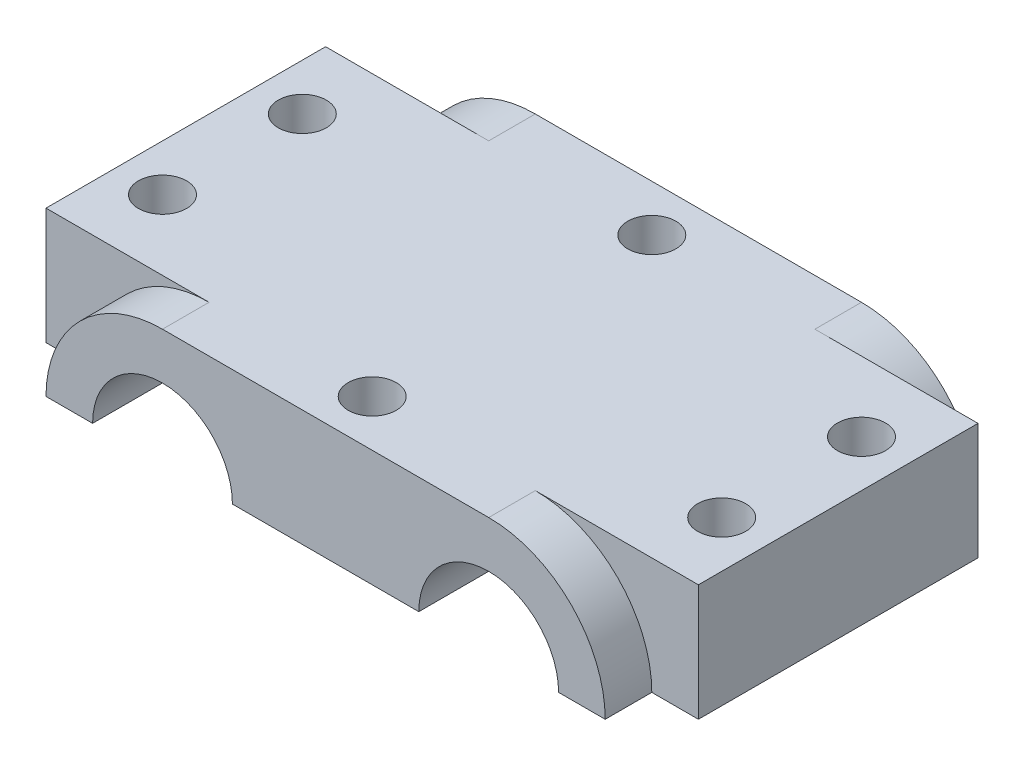
ISO-10303-21;
HEADER;
FILE_DESCRIPTION(('STEP AP214'),'2;1');
FILE_NAME('part.step','',(''),(''),'','','');
FILE_SCHEMA(('AUTOMOTIVE_DESIGN { 1 0 10303 214 1 1 1 1 }'));
ENDSEC;
DATA;
#1=APPLICATION_CONTEXT('core data for automotive mechanical design processes');
#2=APPLICATION_PROTOCOL_DEFINITION('international standard','automotive_design',2000,#1);
#3=PRODUCT_CONTEXT('',#1,'mechanical');
#4=PRODUCT('Part','Part','',(#3));
#5=PRODUCT_RELATED_PRODUCT_CATEGORY('part','',(#4));
#6=PRODUCT_DEFINITION_FORMATION('','',#4);
#7=PRODUCT_DEFINITION_CONTEXT('part definition',#1,'design');
#8=PRODUCT_DEFINITION('design','',#6,#7);
#9=PRODUCT_DEFINITION_SHAPE('','',#8);
#10=(LENGTH_UNIT() NAMED_UNIT(*) SI_UNIT(.MILLI.,.METRE.));
#11=(NAMED_UNIT(*) PLANE_ANGLE_UNIT() SI_UNIT($,.RADIAN.));
#12=(NAMED_UNIT(*) SI_UNIT($,.STERADIAN.) SOLID_ANGLE_UNIT());
#13=UNCERTAINTY_MEASURE_WITH_UNIT(LENGTH_MEASURE(1.E-05),#10,'distance_accuracy_value','');
#14=(GEOMETRIC_REPRESENTATION_CONTEXT(3) GLOBAL_UNCERTAINTY_ASSIGNED_CONTEXT((#13)) GLOBAL_UNIT_ASSIGNED_CONTEXT((#10,
#11,#12)) REPRESENTATION_CONTEXT('',''));
#15=CARTESIAN_POINT('',(0.,0.,0.));
#16=DIRECTION('',(0.,0.,1.));
#17=DIRECTION('',(1.,0.,0.));
#18=AXIS2_PLACEMENT_3D('',#15,#16,#17);
#19=CARTESIAN_POINT('',(44.45,-15.875,50.8));
#20=DIRECTION('',(0.,0.,-1.));
#21=DIRECTION('',(-1.,0.,0.));
#22=AXIS2_PLACEMENT_3D('',#19,#20,#21);
#23=CYLINDRICAL_SURFACE('',#22,31.75);
#24=DIRECTION('',(0.,0.,-1.));
#25=VECTOR('',#24,1.);
#26=CARTESIAN_POINT('',(44.45,15.875,50.8));
#27=LINE('',#26,#25);
#28=CARTESIAN_POINT('',(44.45,15.875,-38.1));
#29=VERTEX_POINT('',#28);
#30=CARTESIAN_POINT('',(44.45,15.875,-50.8));
#31=VERTEX_POINT('',#30);
#32=EDGE_CURVE('E223',#29,#31,#27,.T.);
#33=ORIENTED_EDGE('',*,*,#32,.F.);
#34=CARTESIAN_POINT('',(44.45,-15.875,-38.1));
#35=DIRECTION('',(0.,0.,1.));
#36=DIRECTION('',(1.,0.,0.));
#37=AXIS2_PLACEMENT_3D('',#34,#35,#36);
#38=CIRCLE('',#37,31.75);
#39=CARTESIAN_POINT('',(76.2,-15.875,-38.1));
#40=VERTEX_POINT('',#39);
#41=EDGE_CURVE('E161',#29,#40,#38,.F.);
#42=ORIENTED_EDGE('',*,*,#41,.T.);
#43=DIRECTION('',(0.,0.,-1.));
#44=VECTOR('',#43,1.);
#45=CARTESIAN_POINT('',(76.2,-15.875,50.8));
#46=LINE('',#45,#44);
#47=CARTESIAN_POINT('',(76.2,-15.875,-50.8));
#48=VERTEX_POINT('',#47);
#49=EDGE_CURVE('E227',#40,#48,#46,.T.);
#50=ORIENTED_EDGE('',*,*,#49,.T.);
#51=CARTESIAN_POINT('',(44.45,-15.875,-50.8));
#52=DIRECTION('',(0.,0.,1.));
#53=DIRECTION('',(1.,0.,0.));
#54=AXIS2_PLACEMENT_3D('',#51,#52,#53);
#55=CIRCLE('',#54,31.75);
#56=EDGE_CURVE('E208',#31,#48,#55,.F.);
#57=ORIENTED_EDGE('',*,*,#56,.F.);
#58=EDGE_LOOP('',(#33,#42,#50,#57));
#59=FACE_BOUND('',#58,.T.);
#60=ADVANCED_FACE('F35',(#59),#23,.T.);
#61=CARTESIAN_POINT('',(0.,15.875,38.1));
#62=DIRECTION('',(0.,-1.,0.));
#63=DIRECTION('',(1.,0.,0.));
#64=AXIS2_PLACEMENT_3D('',#61,#62,#63);
#65=PLANE('',#64);
#66=CARTESIAN_POINT('',(0.,15.875,-38.1));
#67=DIRECTION('',(0.,1.,0.));
#68=DIRECTION('',(-1.,0.,0.));
#69=AXIS2_PLACEMENT_3D('',#66,#67,#68);
#70=CIRCLE('',#69,6.5532);
#71=CARTESIAN_POINT('',(-6.5532,15.875,-38.1));
#72=VERTEX_POINT('',#71);
#73=EDGE_CURVE('E125',#72,#72,#70,.T.);
#74=ORIENTED_EDGE('',*,*,#73,.F.);
#75=EDGE_LOOP('',(#74));
#76=FACE_BOUND('',#75,.T.);
#77=CARTESIAN_POINT('',(76.2,15.875,-19.05));
#78=DIRECTION('',(0.,1.,0.));
#79=DIRECTION('',(-1.,0.,0.));
#80=AXIS2_PLACEMENT_3D('',#77,#78,#79);
#81=CIRCLE('',#80,6.55319999999999);
#82=CARTESIAN_POINT('',(69.6468,15.875,-19.05));
#83=VERTEX_POINT('',#82);
#84=EDGE_CURVE('E498',#83,#83,#81,.T.);
#85=ORIENTED_EDGE('',*,*,#84,.F.);
#86=EDGE_LOOP('',(#85));
#87=FACE_BOUND('',#86,.T.);
#88=CARTESIAN_POINT('',(76.2,15.875,19.05));
#89=DIRECTION('',(0.,1.,0.));
#90=DIRECTION('',(1.,0.,0.));
#91=AXIS2_PLACEMENT_3D('',#88,#89,#90);
#92=CIRCLE('',#91,6.55319999999999);
#93=CARTESIAN_POINT('',(82.7532,15.875,19.05));
#94=VERTEX_POINT('',#93);
#95=EDGE_CURVE('E494',#94,#94,#92,.T.);
#96=ORIENTED_EDGE('',*,*,#95,.F.);
#97=EDGE_LOOP('',(#96));
#98=FACE_BOUND('',#97,.T.);
#99=CARTESIAN_POINT('',(0.,15.875,38.1));
#100=DIRECTION('',(0.,1.,0.));
#101=DIRECTION('',(1.,0.,0.));
#102=AXIS2_PLACEMENT_3D('',#99,#100,#101);
#103=CIRCLE('',#102,6.5532);
#104=CARTESIAN_POINT('',(6.5532,15.875,38.1));
#105=VERTEX_POINT('',#104);
#106=EDGE_CURVE('E492',#105,#105,#103,.T.);
#107=ORIENTED_EDGE('',*,*,#106,.F.);
#108=EDGE_LOOP('',(#107));
#109=FACE_BOUND('',#108,.T.);
#110=CARTESIAN_POINT('',(-76.2,15.875,19.05));
#111=DIRECTION('',(0.,1.,0.));
#112=DIRECTION('',(1.,0.,0.));
#113=AXIS2_PLACEMENT_3D('',#110,#111,#112);
#114=CIRCLE('',#113,6.55319999999999);
#115=CARTESIAN_POINT('',(-69.6468,15.875,19.05));
#116=VERTEX_POINT('',#115);
#117=EDGE_CURVE('E143',#116,#116,#114,.T.);
#118=ORIENTED_EDGE('',*,*,#117,.F.);
#119=EDGE_LOOP('',(#118));
#120=FACE_BOUND('',#119,.T.);
#121=CARTESIAN_POINT('',(-76.2,15.875,-19.05));
#122=DIRECTION('',(0.,1.,0.));
#123=DIRECTION('',(-1.,0.,0.));
#124=AXIS2_PLACEMENT_3D('',#121,#122,#123);
#125=CIRCLE('',#124,6.55319999999999);
#126=CARTESIAN_POINT('',(-82.7532,15.875,-19.05));
#127=VERTEX_POINT('',#126);
#128=EDGE_CURVE('E120',#127,#127,#125,.T.);
#129=ORIENTED_EDGE('',*,*,#128,.F.);
#130=EDGE_LOOP('',(#129));
#131=FACE_BOUND('',#130,.T.);
#132=DIRECTION('',(-1.,0.,0.));
#133=VECTOR('',#132,1.);
#134=CARTESIAN_POINT('',(0.,15.875,-38.1));
#135=LINE('',#134,#133);
#136=CARTESIAN_POINT('',(-44.45,15.875,-38.1));
#137=VERTEX_POINT('',#136);
#138=CARTESIAN_POINT('',(-88.9,15.875,-38.1));
#139=VERTEX_POINT('',#138);
#140=EDGE_CURVE('E103',#137,#139,#135,.T.);
#141=ORIENTED_EDGE('',*,*,#140,.T.);
#142=DIRECTION('',(0.,0.,-1.));
#143=VECTOR('',#142,1.);
#144=CARTESIAN_POINT('',(-88.9,15.875,38.1));
#145=LINE('',#144,#143);
#146=CARTESIAN_POINT('',(-88.9,15.875,38.1));
#147=VERTEX_POINT('',#146);
#148=EDGE_CURVE('E11',#147,#139,#145,.T.);
#149=ORIENTED_EDGE('',*,*,#148,.F.);
#150=DIRECTION('',(-1.,0.,0.));
#151=VECTOR('',#150,1.);
#152=CARTESIAN_POINT('',(0.,15.875,38.1));
#153=LINE('',#152,#151);
#154=CARTESIAN_POINT('',(-44.45,15.875,38.1));
#155=VERTEX_POINT('',#154);
#156=EDGE_CURVE('E238',#155,#147,#153,.T.);
#157=ORIENTED_EDGE('',*,*,#156,.F.);
#158=DIRECTION('',(0.,0.,-1.));
#159=VECTOR('',#158,1.);
#160=CARTESIAN_POINT('',(-44.45,15.875,50.8));
#161=LINE('',#160,#159);
#162=CARTESIAN_POINT('',(-44.45,15.875,50.8));
#163=VERTEX_POINT('',#162);
#164=EDGE_CURVE('E220',#163,#155,#161,.T.);
#165=ORIENTED_EDGE('',*,*,#164,.F.);
#166=DIRECTION('',(-1.,0.,0.));
#167=VECTOR('',#166,1.);
#168=CARTESIAN_POINT('',(0.,15.875,50.8));
#169=LINE('',#168,#167);
#170=CARTESIAN_POINT('',(44.45,15.875,50.8));
#171=VERTEX_POINT('',#170);
#172=EDGE_CURVE('E188',#171,#163,#169,.T.);
#173=ORIENTED_EDGE('',*,*,#172,.F.);
#174=CARTESIAN_POINT('',(44.45,15.875,38.1));
#175=VERTEX_POINT('',#174);
#176=EDGE_CURVE('E224',#171,#175,#27,.T.);
#177=ORIENTED_EDGE('',*,*,#176,.T.);
#178=DIRECTION('',(-1.,0.,0.));
#179=VECTOR('',#178,1.);
#180=CARTESIAN_POINT('',(0.,15.875,38.1));
#181=LINE('',#180,#179);
#182=CARTESIAN_POINT('',(88.9,15.875,38.1));
#183=VERTEX_POINT('',#182);
#184=EDGE_CURVE('E145',#183,#175,#181,.T.);
#185=ORIENTED_EDGE('',*,*,#184,.F.);
#186=DIRECTION('',(0.,0.,-1.));
#187=VECTOR('',#186,1.);
#188=CARTESIAN_POINT('',(88.9,15.875,38.1));
#189=LINE('',#188,#187);
#190=CARTESIAN_POINT('',(88.9,15.875,-38.1));
#191=VERTEX_POINT('',#190);
#192=EDGE_CURVE('E158',#183,#191,#189,.T.);
#193=ORIENTED_EDGE('',*,*,#192,.T.);
#194=DIRECTION('',(-1.,0.,0.));
#195=VECTOR('',#194,1.);
#196=CARTESIAN_POINT('',(0.,15.875,-38.1));
#197=LINE('',#196,#195);
#198=EDGE_CURVE('E119',#191,#29,#197,.T.);
#199=ORIENTED_EDGE('',*,*,#198,.T.);
#200=ORIENTED_EDGE('',*,*,#32,.T.);
#201=DIRECTION('',(-1.,0.,0.));
#202=VECTOR('',#201,1.);
#203=CARTESIAN_POINT('',(0.,15.875,-50.8));
#204=LINE('',#203,#202);
#205=CARTESIAN_POINT('',(-44.45,15.875,-50.8));
#206=VERTEX_POINT('',#205);
#207=EDGE_CURVE('E211',#31,#206,#204,.T.);
#208=ORIENTED_EDGE('',*,*,#207,.T.);
#209=EDGE_CURVE('E219',#137,#206,#161,.T.);
#210=ORIENTED_EDGE('',*,*,#209,.F.);
#211=EDGE_LOOP('',(#141,#149,#157,#165,#173,#177,#185,#193,#199,#200,#208,#210));
#212=FACE_BOUND('',#211,.T.);
#213=ADVANCED_FACE('F37',(#76,#87,#98,#109,#120,#131,#212),#65,.F.);
#214=CARTESIAN_POINT('',(-88.9,0.,38.1));
#215=DIRECTION('',(-1.,0.,0.));
#216=DIRECTION('',(0.,0.,1.));
#217=AXIS2_PLACEMENT_3D('',#214,#215,#216);
#218=PLANE('',#217);
#219=DIRECTION('',(0.,1.,0.));
#220=VECTOR('',#219,1.);
#221=CARTESIAN_POINT('',(-88.9,0.,-38.1));
#222=LINE('',#221,#220);
#223=CARTESIAN_POINT('',(-88.9,-15.875,-38.1));
#224=VERTEX_POINT('',#223);
#225=EDGE_CURVE('E98',#224,#139,#222,.T.);
#226=ORIENTED_EDGE('',*,*,#225,.F.);
#227=DIRECTION('',(0.,0.,-1.));
#228=VECTOR('',#227,1.);
#229=CARTESIAN_POINT('',(-88.9,-15.875,38.1));
#230=LINE('',#229,#228);
#231=CARTESIAN_POINT('',(-88.9,-15.875,38.1));
#232=VERTEX_POINT('',#231);
#233=EDGE_CURVE('E44',#232,#224,#230,.T.);
#234=ORIENTED_EDGE('',*,*,#233,.F.);
#235=DIRECTION('',(0.,1.,0.));
#236=VECTOR('',#235,1.);
#237=CARTESIAN_POINT('',(-88.9,0.,38.1));
#238=LINE('',#237,#236);
#239=EDGE_CURVE('E239',#232,#147,#238,.T.);
#240=ORIENTED_EDGE('',*,*,#239,.T.);
#241=ORIENTED_EDGE('',*,*,#148,.T.);
#242=EDGE_LOOP('',(#226,#234,#240,#241));
#243=FACE_BOUND('',#242,.T.);
#244=ADVANCED_FACE('F288',(#243),#218,.T.);
#245=CARTESIAN_POINT('',(0.,-15.875,38.1));
#246=DIRECTION('',(0.,1.,0.));
#247=DIRECTION('',(-1.,0.,0.));
#248=AXIS2_PLACEMENT_3D('',#245,#246,#247);
#249=PLANE('',#248);
#250=CARTESIAN_POINT('',(-76.2,-15.875,19.05));
#251=DIRECTION('',(0.,1.,0.));
#252=DIRECTION('',(-1.,0.,0.));
#253=AXIS2_PLACEMENT_3D('',#250,#251,#252);
#254=CIRCLE('',#253,6.55319999999999);
#255=CARTESIAN_POINT('',(-82.7532,-15.875,19.05));
#256=VERTEX_POINT('',#255);
#257=EDGE_CURVE('E39',#256,#256,#254,.T.);
#258=ORIENTED_EDGE('',*,*,#257,.T.);
#259=EDGE_LOOP('',(#258));
#260=FACE_BOUND('',#259,.T.);
#261=CARTESIAN_POINT('',(-76.2,-15.875,-19.05));
#262=DIRECTION('',(0.,1.,0.));
#263=DIRECTION('',(-1.,0.,0.));
#264=AXIS2_PLACEMENT_3D('',#261,#262,#263);
#265=CIRCLE('',#264,6.55319999999999);
#266=CARTESIAN_POINT('',(-82.7532,-15.875,-19.05));
#267=VERTEX_POINT('',#266);
#268=EDGE_CURVE('E116',#267,#267,#265,.T.);
#269=ORIENTED_EDGE('',*,*,#268,.T.);
#270=EDGE_LOOP('',(#269));
#271=FACE_BOUND('',#270,.T.);
#272=DIRECTION('',(1.,0.,0.));
#273=VECTOR('',#272,1.);
#274=CARTESIAN_POINT('',(0.,-15.875,-38.1));
#275=LINE('',#274,#273);
#276=CARTESIAN_POINT('',(-76.2,-15.875,-38.1));
#277=VERTEX_POINT('',#276);
#278=EDGE_CURVE('E93',#224,#277,#275,.T.);
#279=ORIENTED_EDGE('',*,*,#278,.T.);
#280=DIRECTION('',(0.,0.,-1.));
#281=VECTOR('',#280,1.);
#282=CARTESIAN_POINT('',(-76.2,-15.875,50.8));
#283=LINE('',#282,#281);
#284=CARTESIAN_POINT('',(-76.2,-15.875,-50.8));
#285=VERTEX_POINT('',#284);
#286=EDGE_CURVE('E76',#277,#285,#283,.T.);
#287=ORIENTED_EDGE('',*,*,#286,.T.);
#288=DIRECTION('',(1.,0.,0.));
#289=VECTOR('',#288,1.);
#290=CARTESIAN_POINT('',(0.,-15.875,-50.8));
#291=LINE('',#290,#289);
#292=CARTESIAN_POINT('',(-63.5,-15.875,-50.8));
#293=VERTEX_POINT('',#292);
#294=EDGE_CURVE('E176',#285,#293,#291,.T.);
#295=ORIENTED_EDGE('',*,*,#294,.T.);
#296=DIRECTION('',(0.,0.,-1.));
#297=VECTOR('',#296,1.);
#298=CARTESIAN_POINT('',(-63.5,-15.875,50.8));
#299=LINE('',#298,#297);
#300=CARTESIAN_POINT('',(-63.5,-15.875,50.8));
#301=VERTEX_POINT('',#300);
#302=EDGE_CURVE('E90',#301,#293,#299,.T.);
#303=ORIENTED_EDGE('',*,*,#302,.F.);
#304=DIRECTION('',(1.,0.,0.));
#305=VECTOR('',#304,1.);
#306=CARTESIAN_POINT('',(0.,-15.875,50.8));
#307=LINE('',#306,#305);
#308=CARTESIAN_POINT('',(-76.2,-15.875,50.8));
#309=VERTEX_POINT('',#308);
#310=EDGE_CURVE('E194',#309,#301,#307,.T.);
#311=ORIENTED_EDGE('',*,*,#310,.F.);
#312=CARTESIAN_POINT('',(-76.2,-15.875,38.1));
#313=VERTEX_POINT('',#312);
#314=EDGE_CURVE('E89',#309,#313,#283,.T.);
#315=ORIENTED_EDGE('',*,*,#314,.T.);
#316=DIRECTION('',(1.,0.,0.));
#317=VECTOR('',#316,1.);
#318=CARTESIAN_POINT('',(0.,-15.875,38.1));
#319=LINE('',#318,#317);
#320=EDGE_CURVE('E111',#232,#313,#319,.T.);
#321=ORIENTED_EDGE('',*,*,#320,.F.);
#322=ORIENTED_EDGE('',*,*,#233,.T.);
#323=EDGE_LOOP('',(#279,#287,#295,#303,#311,#315,#321,#322));
#324=FACE_BOUND('',#323,.T.);
#325=ADVANCED_FACE('F94',(#260,#271,#324),#249,.F.);
#326=CARTESIAN_POINT('',(0.,0.,38.1));
#327=DIRECTION('',(0.,0.,1.));
#328=DIRECTION('',(1.,0.,0.));
#329=AXIS2_PLACEMENT_3D('',#326,#327,#328);
#330=PLANE('',#329);
#331=CARTESIAN_POINT('',(-44.45,-15.875,38.1));
#332=DIRECTION('',(0.,0.,1.));
#333=DIRECTION('',(1.,0.,0.));
#334=AXIS2_PLACEMENT_3D('',#331,#332,#333);
#335=CIRCLE('',#334,31.75);
#336=EDGE_CURVE('E97',#155,#313,#335,.T.);
#337=ORIENTED_EDGE('',*,*,#336,.F.);
#338=ORIENTED_EDGE('',*,*,#156,.T.);
#339=ORIENTED_EDGE('',*,*,#239,.F.);
#340=ORIENTED_EDGE('',*,*,#320,.T.);
#341=EDGE_LOOP('',(#337,#338,#339,#340));
#342=FACE_BOUND('',#341,.T.);
#343=ADVANCED_FACE('F245',(#342),#330,.T.);
#344=CARTESIAN_POINT('',(0.,0.,-38.1));
#345=DIRECTION('',(0.,0.,1.));
#346=DIRECTION('',(1.,0.,0.));
#347=AXIS2_PLACEMENT_3D('',#344,#345,#346);
#348=PLANE('',#347);
#349=CARTESIAN_POINT('',(-44.45,-15.875,-38.1));
#350=DIRECTION('',(0.,0.,1.));
#351=DIRECTION('',(1.,0.,0.));
#352=AXIS2_PLACEMENT_3D('',#349,#350,#351);
#353=CIRCLE('',#352,31.75);
#354=EDGE_CURVE('E81',#137,#277,#353,.T.);
#355=ORIENTED_EDGE('',*,*,#354,.T.);
#356=ORIENTED_EDGE('',*,*,#278,.F.);
#357=ORIENTED_EDGE('',*,*,#225,.T.);
#358=ORIENTED_EDGE('',*,*,#140,.F.);
#359=EDGE_LOOP('',(#355,#356,#357,#358));
#360=FACE_BOUND('',#359,.T.);
#361=ADVANCED_FACE('F101',(#360),#348,.F.);
#362=CARTESIAN_POINT('',(-44.45,-15.875,50.8));
#363=DIRECTION('',(0.,0.,-1.));
#364=DIRECTION('',(-1.,0.,0.));
#365=AXIS2_PLACEMENT_3D('',#362,#363,#364);
#366=CYLINDRICAL_SURFACE('',#365,31.75);
#367=ORIENTED_EDGE('',*,*,#286,.F.);
#368=ORIENTED_EDGE('',*,*,#354,.F.);
#369=ORIENTED_EDGE('',*,*,#209,.T.);
#370=CARTESIAN_POINT('',(-44.45,-15.875,-50.8));
#371=DIRECTION('',(0.,0.,1.));
#372=DIRECTION('',(1.,0.,0.));
#373=AXIS2_PLACEMENT_3D('',#370,#371,#372);
#374=CIRCLE('',#373,31.75);
#375=EDGE_CURVE('E85',#206,#285,#374,.T.);
#376=ORIENTED_EDGE('',*,*,#375,.T.);
#377=EDGE_LOOP('',(#367,#368,#369,#376));
#378=FACE_BOUND('',#377,.T.);
#379=ADVANCED_FACE('F78',(#378),#366,.T.);
#380=CARTESIAN_POINT('',(-44.45,-15.875,50.8));
#381=DIRECTION('',(0.,0.,-1.));
#382=DIRECTION('',(-1.,0.,0.));
#383=AXIS2_PLACEMENT_3D('',#380,#381,#382);
#384=CYLINDRICAL_SURFACE('',#383,19.05);
#385=CARTESIAN_POINT('',(-44.45,-15.875,-50.8));
#386=DIRECTION('',(0.,0.,1.));
#387=DIRECTION('',(1.,0.,0.));
#388=AXIS2_PLACEMENT_3D('',#385,#386,#387);
#389=CIRCLE('',#388,19.05);
#390=CARTESIAN_POINT('',(-25.4,-15.875,-50.8));
#391=VERTEX_POINT('',#390);
#392=EDGE_CURVE('E171',#391,#293,#389,.T.);
#393=ORIENTED_EDGE('',*,*,#392,.F.);
#394=DIRECTION('',(0.,0.,-1.));
#395=VECTOR('',#394,1.);
#396=CARTESIAN_POINT('',(-25.4,-15.875,50.8));
#397=LINE('',#396,#395);
#398=CARTESIAN_POINT('',(-25.4,-15.875,50.8));
#399=VERTEX_POINT('',#398);
#400=EDGE_CURVE('E104',#399,#391,#397,.T.);
#401=ORIENTED_EDGE('',*,*,#400,.F.);
#402=CARTESIAN_POINT('',(-44.45,-15.875,50.8));
#403=DIRECTION('',(0.,0.,1.));
#404=DIRECTION('',(1.,0.,0.));
#405=AXIS2_PLACEMENT_3D('',#402,#403,#404);
#406=CIRCLE('',#405,19.05);
#407=EDGE_CURVE('E172',#399,#301,#406,.T.);
#408=ORIENTED_EDGE('',*,*,#407,.T.);
#409=ORIENTED_EDGE('',*,*,#302,.T.);
#410=EDGE_LOOP('',(#393,#401,#408,#409));
#411=FACE_BOUND('',#410,.T.);
#412=ADVANCED_FACE('F379',(#411),#384,.F.);
#413=CARTESIAN_POINT('',(0.,-15.875,50.8));
#414=DIRECTION('',(0.,-1.,0.));
#415=DIRECTION('',(0.,0.,-1.));
#416=AXIS2_PLACEMENT_3D('',#413,#414,#415);
#417=PLANE('',#416);
#418=CARTESIAN_POINT('',(0.,-15.875,-38.1));
#419=DIRECTION('',(0.,-1.,0.));
#420=DIRECTION('',(0.,0.,-1.));
#421=AXIS2_PLACEMENT_3D('',#418,#419,#420);
#422=CIRCLE('',#421,6.5532);
#423=CARTESIAN_POINT('',(0.,-15.875,-44.6532));
#424=VERTEX_POINT('',#423);
#425=EDGE_CURVE('E130',#424,#424,#422,.T.);
#426=ORIENTED_EDGE('',*,*,#425,.F.);
#427=EDGE_LOOP('',(#426));
#428=FACE_BOUND('',#427,.T.);
#429=CARTESIAN_POINT('',(0.,-15.875,38.1));
#430=DIRECTION('',(0.,-1.,0.));
#431=DIRECTION('',(0.,0.,-1.));
#432=AXIS2_PLACEMENT_3D('',#429,#430,#431);
#433=CIRCLE('',#432,6.5532);
#434=CARTESIAN_POINT('',(0.,-15.875,31.5468));
#435=VERTEX_POINT('',#434);
#436=EDGE_CURVE('E128',#435,#435,#433,.T.);
#437=ORIENTED_EDGE('',*,*,#436,.F.);
#438=EDGE_LOOP('',(#437));
#439=FACE_BOUND('',#438,.T.);
#440=DIRECTION('',(-1.,0.,0.));
#441=VECTOR('',#440,1.);
#442=CARTESIAN_POINT('',(0.,-15.875,-50.8));
#443=LINE('',#442,#441);
#444=CARTESIAN_POINT('',(25.4,-15.875,-50.8));
#445=VERTEX_POINT('',#444);
#446=EDGE_CURVE('E199',#445,#391,#443,.T.);
#447=ORIENTED_EDGE('',*,*,#446,.F.);
#448=DIRECTION('',(0.,0.,-1.));
#449=VECTOR('',#448,1.);
#450=CARTESIAN_POINT('',(25.4,-15.875,50.8));
#451=LINE('',#450,#449);
#452=CARTESIAN_POINT('',(25.4,-15.875,50.8));
#453=VERTEX_POINT('',#452);
#454=EDGE_CURVE('E108',#453,#445,#451,.T.);
#455=ORIENTED_EDGE('',*,*,#454,.F.);
#456=DIRECTION('',(-1.,0.,0.));
#457=VECTOR('',#456,1.);
#458=CARTESIAN_POINT('',(0.,-15.875,50.8));
#459=LINE('',#458,#457);
#460=EDGE_CURVE('E175',#453,#399,#459,.T.);
#461=ORIENTED_EDGE('',*,*,#460,.T.);
#462=ORIENTED_EDGE('',*,*,#400,.T.);
#463=EDGE_LOOP('',(#447,#455,#461,#462));
#464=FACE_BOUND('',#463,.T.);
#465=ADVANCED_FACE('F382',(#428,#439,#464),#417,.T.);
#466=CARTESIAN_POINT('',(44.45,-15.875,50.8));
#467=DIRECTION('',(0.,0.,-1.));
#468=DIRECTION('',(-1.,0.,0.));
#469=AXIS2_PLACEMENT_3D('',#466,#467,#468);
#470=CYLINDRICAL_SURFACE('',#469,19.05);
#471=CARTESIAN_POINT('',(44.45,-15.875,-50.8));
#472=DIRECTION('',(0.,0.,1.));
#473=DIRECTION('',(1.,0.,0.));
#474=AXIS2_PLACEMENT_3D('',#471,#472,#473);
#475=CIRCLE('',#474,19.05);
#476=CARTESIAN_POINT('',(63.5,-15.875,-50.8));
#477=VERTEX_POINT('',#476);
#478=EDGE_CURVE('E202',#445,#477,#475,.F.);
#479=ORIENTED_EDGE('',*,*,#478,.T.);
#480=DIRECTION('',(0.,0.,-1.));
#481=VECTOR('',#480,1.);
#482=CARTESIAN_POINT('',(63.5,-15.875,50.8));
#483=LINE('',#482,#481);
#484=CARTESIAN_POINT('',(63.5,-15.875,50.8));
#485=VERTEX_POINT('',#484);
#486=EDGE_CURVE('E231',#485,#477,#483,.T.);
#487=ORIENTED_EDGE('',*,*,#486,.F.);
#488=CARTESIAN_POINT('',(44.45,-15.875,50.8));
#489=DIRECTION('',(0.,0.,1.));
#490=DIRECTION('',(1.,0.,0.));
#491=AXIS2_PLACEMENT_3D('',#488,#489,#490);
#492=CIRCLE('',#491,19.05);
#493=EDGE_CURVE('E179',#453,#485,#492,.F.);
#494=ORIENTED_EDGE('',*,*,#493,.F.);
#495=ORIENTED_EDGE('',*,*,#454,.T.);
#496=EDGE_LOOP('',(#479,#487,#494,#495));
#497=FACE_BOUND('',#496,.T.);
#498=ADVANCED_FACE('F313',(#497),#470,.F.);
#499=CARTESIAN_POINT('',(0.,-15.875,50.8));
#500=DIRECTION('',(0.,-1.,0.));
#501=DIRECTION('',(1.,0.,0.));
#502=AXIS2_PLACEMENT_3D('',#499,#500,#501);
#503=PLANE('',#502);
#504=CARTESIAN_POINT('',(76.2,-15.875,-19.05));
#505=DIRECTION('',(0.,-1.,0.));
#506=DIRECTION('',(1.,0.,0.));
#507=AXIS2_PLACEMENT_3D('',#504,#505,#506);
#508=CIRCLE('',#507,6.55319999999999);
#509=CARTESIAN_POINT('',(82.7532,-15.875,-19.05));
#510=VERTEX_POINT('',#509);
#511=EDGE_CURVE('E124',#510,#510,#508,.T.);
#512=ORIENTED_EDGE('',*,*,#511,.F.);
#513=EDGE_LOOP('',(#512));
#514=FACE_BOUND('',#513,.T.);
#515=CARTESIAN_POINT('',(76.2,-15.875,19.05));
#516=DIRECTION('',(0.,-1.,0.));
#517=DIRECTION('',(1.,0.,0.));
#518=AXIS2_PLACEMENT_3D('',#515,#516,#517);
#519=CIRCLE('',#518,6.55319999999999);
#520=CARTESIAN_POINT('',(82.7532,-15.875,19.05));
#521=VERTEX_POINT('',#520);
#522=EDGE_CURVE('E121',#521,#521,#519,.T.);
#523=ORIENTED_EDGE('',*,*,#522,.F.);
#524=EDGE_LOOP('',(#523));
#525=FACE_BOUND('',#524,.T.);
#526=DIRECTION('',(-1.,0.,0.));
#527=VECTOR('',#526,1.);
#528=CARTESIAN_POINT('',(0.,-15.875,-50.8));
#529=LINE('',#528,#527);
#530=EDGE_CURVE('E205',#48,#477,#529,.T.);
#531=ORIENTED_EDGE('',*,*,#530,.F.);
#532=ORIENTED_EDGE('',*,*,#49,.F.);
#533=DIRECTION('',(-1.,0.,0.));
#534=VECTOR('',#533,1.);
#535=CARTESIAN_POINT('',(0.,-15.875,-38.1));
#536=LINE('',#535,#534);
#537=CARTESIAN_POINT('',(88.9,-15.875,-38.1));
#538=VERTEX_POINT('',#537);
#539=EDGE_CURVE('E52',#538,#40,#536,.T.);
#540=ORIENTED_EDGE('',*,*,#539,.F.);
#541=DIRECTION('',(0.,0.,-1.));
#542=VECTOR('',#541,1.);
#543=CARTESIAN_POINT('',(88.9,-15.875,38.1));
#544=LINE('',#543,#542);
#545=CARTESIAN_POINT('',(88.9,-15.875,38.1));
#546=VERTEX_POINT('',#545);
#547=EDGE_CURVE('E168',#546,#538,#544,.T.);
#548=ORIENTED_EDGE('',*,*,#547,.F.);
#549=DIRECTION('',(-1.,0.,0.));
#550=VECTOR('',#549,1.);
#551=CARTESIAN_POINT('',(0.,-15.875,38.1));
#552=LINE('',#551,#550);
#553=CARTESIAN_POINT('',(76.2,-15.875,38.1));
#554=VERTEX_POINT('',#553);
#555=EDGE_CURVE('E152',#546,#554,#552,.T.);
#556=ORIENTED_EDGE('',*,*,#555,.T.);
#557=CARTESIAN_POINT('',(76.2,-15.875,50.8));
#558=VERTEX_POINT('',#557);
#559=EDGE_CURVE('E228',#558,#554,#46,.T.);
#560=ORIENTED_EDGE('',*,*,#559,.F.);
#561=DIRECTION('',(-1.,0.,0.));
#562=VECTOR('',#561,1.);
#563=CARTESIAN_POINT('',(0.,-15.875,50.8));
#564=LINE('',#563,#562);
#565=EDGE_CURVE('E182',#558,#485,#564,.T.);
#566=ORIENTED_EDGE('',*,*,#565,.T.);
#567=ORIENTED_EDGE('',*,*,#486,.T.);
#568=EDGE_LOOP('',(#531,#532,#540,#548,#556,#560,#566,#567));
#569=FACE_BOUND('',#568,.T.);
#570=ADVANCED_FACE('F306',(#514,#525,#569),#503,.T.);
#571=CARTESIAN_POINT('',(44.45,-15.875,38.1));
#572=DIRECTION('',(0.,0.,1.));
#573=DIRECTION('',(1.,0.,0.));
#574=AXIS2_PLACEMENT_3D('',#571,#572,#573);
#575=CIRCLE('',#574,31.75);
#576=EDGE_CURVE('E148',#175,#554,#575,.F.);
#577=ORIENTED_EDGE('',*,*,#576,.F.);
#578=ORIENTED_EDGE('',*,*,#176,.F.);
#579=CARTESIAN_POINT('',(44.45,-15.875,50.8));
#580=DIRECTION('',(0.,0.,1.));
#581=DIRECTION('',(1.,0.,0.));
#582=AXIS2_PLACEMENT_3D('',#579,#580,#581);
#583=CIRCLE('',#582,31.75);
#584=EDGE_CURVE('E185',#171,#558,#583,.F.);
#585=ORIENTED_EDGE('',*,*,#584,.T.);
#586=ORIENTED_EDGE('',*,*,#559,.T.);
#587=EDGE_LOOP('',(#577,#578,#585,#586));
#588=FACE_BOUND('',#587,.T.);
#589=ADVANCED_FACE('F299',(#588),#23,.T.);
#590=ORIENTED_EDGE('',*,*,#336,.T.);
#591=ORIENTED_EDGE('',*,*,#314,.F.);
#592=CARTESIAN_POINT('',(-44.45,-15.875,50.8));
#593=DIRECTION('',(0.,0.,1.));
#594=DIRECTION('',(1.,0.,0.));
#595=AXIS2_PLACEMENT_3D('',#592,#593,#594);
#596=CIRCLE('',#595,31.75);
#597=EDGE_CURVE('E191',#163,#309,#596,.T.);
#598=ORIENTED_EDGE('',*,*,#597,.F.);
#599=ORIENTED_EDGE('',*,*,#164,.T.);
#600=EDGE_LOOP('',(#590,#591,#598,#599));
#601=FACE_BOUND('',#600,.T.);
#602=ADVANCED_FACE('F255',(#601),#366,.T.);
#603=CARTESIAN_POINT('',(0.,0.,50.8));
#604=DIRECTION('',(0.,0.,1.));
#605=DIRECTION('',(1.,0.,0.));
#606=AXIS2_PLACEMENT_3D('',#603,#604,#605);
#607=PLANE('',#606);
#608=ORIENTED_EDGE('',*,*,#407,.F.);
#609=ORIENTED_EDGE('',*,*,#460,.F.);
#610=ORIENTED_EDGE('',*,*,#493,.T.);
#611=ORIENTED_EDGE('',*,*,#565,.F.);
#612=ORIENTED_EDGE('',*,*,#584,.F.);
#613=ORIENTED_EDGE('',*,*,#172,.T.);
#614=ORIENTED_EDGE('',*,*,#597,.T.);
#615=ORIENTED_EDGE('',*,*,#310,.T.);
#616=EDGE_LOOP('',(#608,#609,#610,#611,#612,#613,#614,#615));
#617=FACE_BOUND('',#616,.T.);
#618=ADVANCED_FACE('F312',(#617),#607,.T.);
#619=CARTESIAN_POINT('',(0.,0.,-50.8));
#620=DIRECTION('',(0.,0.,1.));
#621=DIRECTION('',(1.,0.,0.));
#622=AXIS2_PLACEMENT_3D('',#619,#620,#621);
#623=PLANE('',#622);
#624=ORIENTED_EDGE('',*,*,#392,.T.);
#625=ORIENTED_EDGE('',*,*,#294,.F.);
#626=ORIENTED_EDGE('',*,*,#375,.F.);
#627=ORIENTED_EDGE('',*,*,#207,.F.);
#628=ORIENTED_EDGE('',*,*,#56,.T.);
#629=ORIENTED_EDGE('',*,*,#530,.T.);
#630=ORIENTED_EDGE('',*,*,#478,.F.);
#631=ORIENTED_EDGE('',*,*,#446,.T.);
#632=EDGE_LOOP('',(#624,#625,#626,#627,#628,#629,#630,#631));
#633=FACE_BOUND('',#632,.T.);
#634=ADVANCED_FACE('F364',(#633),#623,.F.);
#635=CARTESIAN_POINT('',(88.9,0.,38.1));
#636=DIRECTION('',(-1.,0.,0.));
#637=DIRECTION('',(0.,0.,1.));
#638=AXIS2_PLACEMENT_3D('',#635,#636,#637);
#639=PLANE('',#638);
#640=DIRECTION('',(0.,1.,0.));
#641=VECTOR('',#640,1.);
#642=CARTESIAN_POINT('',(88.9,0.,-38.1));
#643=LINE('',#642,#641);
#644=EDGE_CURVE('E149',#538,#191,#643,.T.);
#645=ORIENTED_EDGE('',*,*,#644,.T.);
#646=ORIENTED_EDGE('',*,*,#192,.F.);
#647=DIRECTION('',(0.,1.,0.));
#648=VECTOR('',#647,1.);
#649=CARTESIAN_POINT('',(88.9,0.,38.1));
#650=LINE('',#649,#648);
#651=EDGE_CURVE('E155',#546,#183,#650,.T.);
#652=ORIENTED_EDGE('',*,*,#651,.F.);
#653=ORIENTED_EDGE('',*,*,#547,.T.);
#654=EDGE_LOOP('',(#645,#646,#652,#653));
#655=FACE_BOUND('',#654,.T.);
#656=ADVANCED_FACE('F353',(#655),#639,.F.);
#657=CARTESIAN_POINT('',(0.,0.,38.1));
#658=DIRECTION('',(0.,0.,1.));
#659=DIRECTION('',(1.,0.,0.));
#660=AXIS2_PLACEMENT_3D('',#657,#658,#659);
#661=PLANE('',#660);
#662=ORIENTED_EDGE('',*,*,#184,.T.);
#663=ORIENTED_EDGE('',*,*,#576,.T.);
#664=ORIENTED_EDGE('',*,*,#555,.F.);
#665=ORIENTED_EDGE('',*,*,#651,.T.);
#666=EDGE_LOOP('',(#662,#663,#664,#665));
#667=FACE_BOUND('',#666,.T.);
#668=ADVANCED_FACE('F354',(#667),#661,.T.);
#669=CARTESIAN_POINT('',(0.,0.,-38.1));
#670=DIRECTION('',(0.,0.,1.));
#671=DIRECTION('',(1.,0.,0.));
#672=AXIS2_PLACEMENT_3D('',#669,#670,#671);
#673=PLANE('',#672);
#674=ORIENTED_EDGE('',*,*,#198,.F.);
#675=ORIENTED_EDGE('',*,*,#644,.F.);
#676=ORIENTED_EDGE('',*,*,#539,.T.);
#677=ORIENTED_EDGE('',*,*,#41,.F.);
#678=EDGE_LOOP('',(#674,#675,#676,#677));
#679=FACE_BOUND('',#678,.T.);
#680=ADVANCED_FACE('F356',(#679),#673,.F.);
#681=CARTESIAN_POINT('',(-76.2,-85.725,-19.05));
#682=DIRECTION('',(0.,1.,0.));
#683=DIRECTION('',(-1.,0.,0.));
#684=AXIS2_PLACEMENT_3D('',#681,#682,#683);
#685=CYLINDRICAL_SURFACE('',#684,6.55319999999999);
#686=ORIENTED_EDGE('',*,*,#128,.T.);
#687=EDGE_LOOP('',(#686));
#688=FACE_BOUND('',#687,.T.);
#689=ORIENTED_EDGE('',*,*,#268,.F.);
#690=EDGE_LOOP('',(#689));
#691=FACE_BOUND('',#690,.T.);
#692=ADVANCED_FACE('F362',(#688,#691),#685,.F.);
#693=CARTESIAN_POINT('',(76.2,-85.725,19.05));
#694=DIRECTION('',(0.,1.,0.));
#695=DIRECTION('',(-1.,0.,0.));
#696=AXIS2_PLACEMENT_3D('',#693,#694,#695);
#697=CYLINDRICAL_SURFACE('',#696,6.55319999999999);
#698=ORIENTED_EDGE('',*,*,#522,.T.);
#699=EDGE_LOOP('',(#698));
#700=FACE_BOUND('',#699,.T.);
#701=ORIENTED_EDGE('',*,*,#95,.T.);
#702=EDGE_LOOP('',(#701));
#703=FACE_BOUND('',#702,.T.);
#704=ADVANCED_FACE('F437',(#700,#703),#697,.F.);
#705=CARTESIAN_POINT('',(76.2,-85.725,-19.05));
#706=DIRECTION('',(0.,1.,0.));
#707=DIRECTION('',(-1.,0.,0.));
#708=AXIS2_PLACEMENT_3D('',#705,#706,#707);
#709=CYLINDRICAL_SURFACE('',#708,6.55319999999999);
#710=ORIENTED_EDGE('',*,*,#511,.T.);
#711=EDGE_LOOP('',(#710));
#712=FACE_BOUND('',#711,.T.);
#713=ORIENTED_EDGE('',*,*,#84,.T.);
#714=EDGE_LOOP('',(#713));
#715=FACE_BOUND('',#714,.T.);
#716=ADVANCED_FACE('F446',(#712,#715),#709,.F.);
#717=CARTESIAN_POINT('',(0.,-85.725,38.1));
#718=DIRECTION('',(0.,1.,0.));
#719=DIRECTION('',(-1.,0.,0.));
#720=AXIS2_PLACEMENT_3D('',#717,#718,#719);
#721=CYLINDRICAL_SURFACE('',#720,6.5532);
#722=ORIENTED_EDGE('',*,*,#436,.T.);
#723=EDGE_LOOP('',(#722));
#724=FACE_BOUND('',#723,.T.);
#725=ORIENTED_EDGE('',*,*,#106,.T.);
#726=EDGE_LOOP('',(#725));
#727=FACE_BOUND('',#726,.T.);
#728=ADVANCED_FACE('F456',(#724,#727),#721,.F.);
#729=CARTESIAN_POINT('',(0.,-85.725,-38.1));
#730=DIRECTION('',(0.,1.,0.));
#731=DIRECTION('',(-1.,0.,0.));
#732=AXIS2_PLACEMENT_3D('',#729,#730,#731);
#733=CYLINDRICAL_SURFACE('',#732,6.5532);
#734=ORIENTED_EDGE('',*,*,#425,.T.);
#735=EDGE_LOOP('',(#734));
#736=FACE_BOUND('',#735,.T.);
#737=ORIENTED_EDGE('',*,*,#73,.T.);
#738=EDGE_LOOP('',(#737));
#739=FACE_BOUND('',#738,.T.);
#740=ADVANCED_FACE('F466',(#736,#739),#733,.F.);
#741=CARTESIAN_POINT('',(-76.2,-85.725,19.05));
#742=DIRECTION('',(0.,1.,0.));
#743=DIRECTION('',(-1.,0.,0.));
#744=AXIS2_PLACEMENT_3D('',#741,#742,#743);
#745=CYLINDRICAL_SURFACE('',#744,6.55319999999999);
#746=ORIENTED_EDGE('',*,*,#117,.T.);
#747=EDGE_LOOP('',(#746));
#748=FACE_BOUND('',#747,.T.);
#749=ORIENTED_EDGE('',*,*,#257,.F.);
#750=EDGE_LOOP('',(#749));
#751=FACE_BOUND('',#750,.T.);
#752=ADVANCED_FACE('F476',(#748,#751),#745,.F.);
#753=CLOSED_SHELL('',(#60,#213,#244,#325,#343,#361,#379,#412,#465,#498,#570,#589,#602,#618,#634,
#656,#668,#680,#692,#704,#716,#728,#740,#752));
#754=MANIFOLD_SOLID_BREP('B2',#753);
#755=ADVANCED_BREP_SHAPE_REPRESENTATION('',(#18,#754),#14);
#756=SHAPE_DEFINITION_REPRESENTATION(#9,#755);
ENDSEC;
END-ISO-10303-21;
